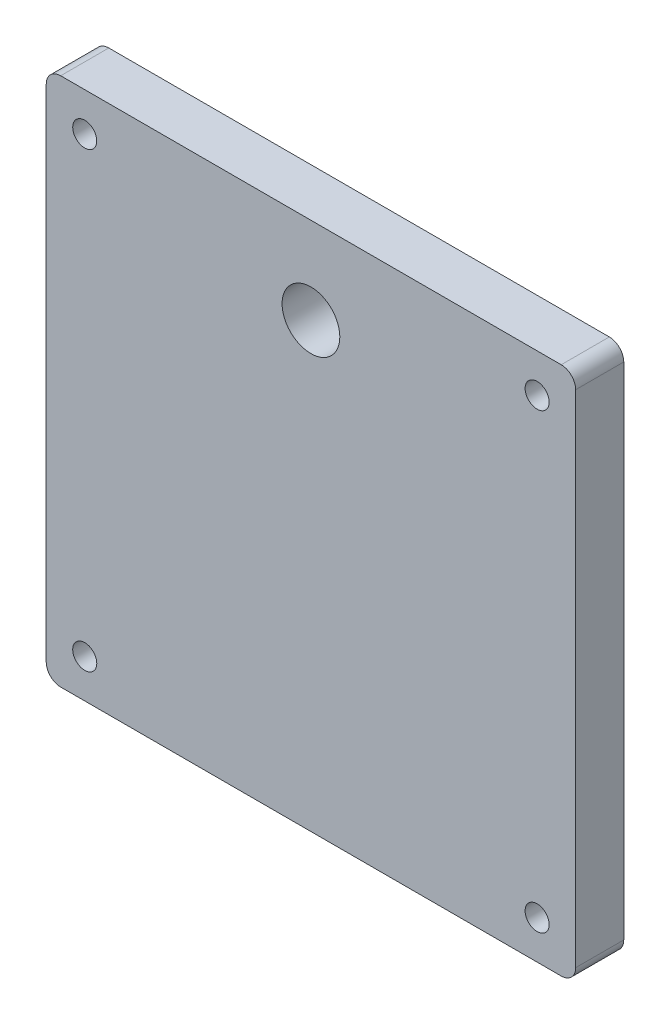
ISO-10303-21;
HEADER;
FILE_DESCRIPTION(('STEP AP214'),'2;1');
FILE_NAME('part.step','',(''),(''),'','','');
FILE_SCHEMA(('AUTOMOTIVE_DESIGN { 1 0 10303 214 1 1 1 1 }'));
ENDSEC;
DATA;
#1=APPLICATION_CONTEXT('core data for automotive mechanical design processes');
#2=APPLICATION_PROTOCOL_DEFINITION('international standard','automotive_design',2000,#1);
#3=PRODUCT_CONTEXT('',#1,'mechanical');
#4=PRODUCT('Part','Part','',(#3));
#5=PRODUCT_RELATED_PRODUCT_CATEGORY('part','',(#4));
#6=PRODUCT_DEFINITION_FORMATION('','',#4);
#7=PRODUCT_DEFINITION_CONTEXT('part definition',#1,'design');
#8=PRODUCT_DEFINITION('design','',#6,#7);
#9=PRODUCT_DEFINITION_SHAPE('','',#8);
#10=(LENGTH_UNIT() NAMED_UNIT(*) SI_UNIT(.MILLI.,.METRE.));
#11=(NAMED_UNIT(*) PLANE_ANGLE_UNIT() SI_UNIT($,.RADIAN.));
#12=(NAMED_UNIT(*) SI_UNIT($,.STERADIAN.) SOLID_ANGLE_UNIT());
#13=UNCERTAINTY_MEASURE_WITH_UNIT(LENGTH_MEASURE(1.E-05),#10,'distance_accuracy_value','');
#14=(GEOMETRIC_REPRESENTATION_CONTEXT(3) GLOBAL_UNCERTAINTY_ASSIGNED_CONTEXT((#13)) GLOBAL_UNIT_ASSIGNED_CONTEXT((#10,
#11,#12)) REPRESENTATION_CONTEXT('',''));
#15=CARTESIAN_POINT('',(0.,0.,0.));
#16=DIRECTION('',(0.,0.,1.));
#17=DIRECTION('',(1.,0.,0.));
#18=AXIS2_PLACEMENT_3D('',#15,#16,#17);
#19=CARTESIAN_POINT('',(52.,-52.,10.));
#20=DIRECTION('',(0.,0.,-1.));
#21=DIRECTION('',(-1.,0.,0.));
#22=AXIS2_PLACEMENT_3D('',#19,#20,#21);
#23=PLANE('',#22);
#24=CARTESIAN_POINT('',(52.,-52.,10.));
#25=DIRECTION('',(0.,0.,1.));
#26=DIRECTION('',(-1.,0.,0.));
#27=AXIS2_PLACEMENT_3D('',#24,#25,#26);
#28=CIRCLE('',#27,3.00000000000001);
#29=CARTESIAN_POINT('',(52.,-55.,10.));
#30=VERTEX_POINT('',#29);
#31=CARTESIAN_POINT('',(55.,-52.,10.));
#32=VERTEX_POINT('',#31);
#33=EDGE_CURVE('E154',#30,#32,#28,.T.);
#34=ORIENTED_EDGE('',*,*,#33,.T.);
#35=DIRECTION('',(0.,1.,0.));
#36=VECTOR('',#35,1.);
#37=CARTESIAN_POINT('',(55.,52.,10.));
#38=LINE('',#37,#36);
#39=CARTESIAN_POINT('',(55.,52.,10.));
#40=VERTEX_POINT('',#39);
#41=EDGE_CURVE('E102',#32,#40,#38,.T.);
#42=ORIENTED_EDGE('',*,*,#41,.T.);
#43=CARTESIAN_POINT('',(52.,52.,10.));
#44=DIRECTION('',(0.,0.,1.));
#45=DIRECTION('',(1.,0.,0.));
#46=AXIS2_PLACEMENT_3D('',#43,#44,#45);
#47=CIRCLE('',#46,3.);
#48=CARTESIAN_POINT('',(52.,55.,10.));
#49=VERTEX_POINT('',#48);
#50=EDGE_CURVE('E169',#40,#49,#47,.T.);
#51=ORIENTED_EDGE('',*,*,#50,.T.);
#52=DIRECTION('',(-1.,0.,0.));
#53=VECTOR('',#52,1.);
#54=CARTESIAN_POINT('',(-52.,55.,10.));
#55=LINE('',#54,#53);
#56=CARTESIAN_POINT('',(-52.,55.,10.));
#57=VERTEX_POINT('',#56);
#58=EDGE_CURVE('E182',#49,#57,#55,.T.);
#59=ORIENTED_EDGE('',*,*,#58,.T.);
#60=CARTESIAN_POINT('',(-52.,52.,10.));
#61=DIRECTION('',(0.,0.,1.));
#62=DIRECTION('',(-1.,0.,0.));
#63=AXIS2_PLACEMENT_3D('',#60,#61,#62);
#64=CIRCLE('',#63,3.);
#65=CARTESIAN_POINT('',(-55.,52.,10.));
#66=VERTEX_POINT('',#65);
#67=EDGE_CURVE('E121',#57,#66,#64,.T.);
#68=ORIENTED_EDGE('',*,*,#67,.T.);
#69=DIRECTION('',(0.,-1.,0.));
#70=VECTOR('',#69,1.);
#71=CARTESIAN_POINT('',(-55.,52.,10.));
#72=LINE('',#71,#70);
#73=CARTESIAN_POINT('',(-55.,-52.,10.));
#74=VERTEX_POINT('',#73);
#75=EDGE_CURVE('E115',#66,#74,#72,.T.);
#76=ORIENTED_EDGE('',*,*,#75,.T.);
#77=CARTESIAN_POINT('',(-52.,-52.,10.));
#78=DIRECTION('',(0.,0.,1.));
#79=DIRECTION('',(-1.,0.,0.));
#80=AXIS2_PLACEMENT_3D('',#77,#78,#79);
#81=CIRCLE('',#80,3.00000000000001);
#82=CARTESIAN_POINT('',(-52.,-55.,10.));
#83=VERTEX_POINT('',#82);
#84=EDGE_CURVE('E119',#74,#83,#81,.T.);
#85=ORIENTED_EDGE('',*,*,#84,.T.);
#86=DIRECTION('',(1.,0.,0.));
#87=VECTOR('',#86,1.);
#88=CARTESIAN_POINT('',(-52.,-55.,10.));
#89=LINE('',#88,#87);
#90=EDGE_CURVE('E59',#83,#30,#89,.T.);
#91=ORIENTED_EDGE('',*,*,#90,.T.);
#92=EDGE_LOOP('',(#34,#42,#51,#59,#68,#76,#85,#91));
#93=FACE_BOUND('',#92,.T.);
#94=CARTESIAN_POINT('',(47.,47.,10.));
#95=DIRECTION('',(0.,0.,1.));
#96=DIRECTION('',(1.,0.,0.));
#97=AXIS2_PLACEMENT_3D('',#94,#95,#96);
#98=CIRCLE('',#97,2.5);
#99=CARTESIAN_POINT('',(49.5,47.,10.));
#100=VERTEX_POINT('',#99);
#101=EDGE_CURVE('E143',#100,#100,#98,.T.);
#102=ORIENTED_EDGE('',*,*,#101,.F.);
#103=EDGE_LOOP('',(#102));
#104=FACE_BOUND('',#103,.T.);
#105=CARTESIAN_POINT('',(47.,-47.,10.));
#106=DIRECTION('',(0.,0.,1.));
#107=DIRECTION('',(-1.,0.,0.));
#108=AXIS2_PLACEMENT_3D('',#105,#106,#107);
#109=CIRCLE('',#108,2.5);
#110=CARTESIAN_POINT('',(44.5,-47.,10.));
#111=VERTEX_POINT('',#110);
#112=EDGE_CURVE('E191',#111,#111,#109,.T.);
#113=ORIENTED_EDGE('',*,*,#112,.F.);
#114=EDGE_LOOP('',(#113));
#115=FACE_BOUND('',#114,.T.);
#116=CARTESIAN_POINT('',(-47.,-47.,10.));
#117=DIRECTION('',(0.,0.,1.));
#118=DIRECTION('',(1.,0.,0.));
#119=AXIS2_PLACEMENT_3D('',#116,#117,#118);
#120=CIRCLE('',#119,2.5);
#121=CARTESIAN_POINT('',(-44.5,-47.,10.));
#122=VERTEX_POINT('',#121);
#123=EDGE_CURVE('E197',#122,#122,#120,.T.);
#124=ORIENTED_EDGE('',*,*,#123,.F.);
#125=EDGE_LOOP('',(#124));
#126=FACE_BOUND('',#125,.T.);
#127=CARTESIAN_POINT('',(-47.,47.,10.));
#128=DIRECTION('',(0.,0.,1.));
#129=DIRECTION('',(-1.,0.,0.));
#130=AXIS2_PLACEMENT_3D('',#127,#128,#129);
#131=CIRCLE('',#130,2.5);
#132=CARTESIAN_POINT('',(-49.5,47.,10.));
#133=VERTEX_POINT('',#132);
#134=EDGE_CURVE('E203',#133,#133,#131,.T.);
#135=ORIENTED_EDGE('',*,*,#134,.F.);
#136=EDGE_LOOP('',(#135));
#137=FACE_BOUND('',#136,.T.);
#138=CARTESIAN_POINT('',(0.,37.,10.));
#139=DIRECTION('',(0.,0.,1.));
#140=DIRECTION('',(1.,0.,0.));
#141=AXIS2_PLACEMENT_3D('',#138,#139,#140);
#142=CIRCLE('',#141,6.);
#143=CARTESIAN_POINT('',(6.00000000000001,37.,10.));
#144=VERTEX_POINT('',#143);
#145=EDGE_CURVE('E209',#144,#144,#142,.T.);
#146=ORIENTED_EDGE('',*,*,#145,.F.);
#147=EDGE_LOOP('',(#146));
#148=FACE_BOUND('',#147,.T.);
#149=ADVANCED_FACE('F42',(#93,#104,#115,#126,#137,#148),#23,.F.);
#150=CARTESIAN_POINT('',(52.,-52.,0.));
#151=DIRECTION('',(0.,0.,-1.));
#152=DIRECTION('',(-1.,0.,0.));
#153=AXIS2_PLACEMENT_3D('',#150,#151,#152);
#154=PLANE('',#153);
#155=CARTESIAN_POINT('',(-47.,47.,0.));
#156=DIRECTION('',(0.,0.,1.));
#157=DIRECTION('',(-1.,0.,0.));
#158=AXIS2_PLACEMENT_3D('',#155,#156,#157);
#159=CIRCLE('',#158,2.5);
#160=CARTESIAN_POINT('',(-49.5,47.,0.));
#161=VERTEX_POINT('',#160);
#162=EDGE_CURVE('E206',#161,#161,#159,.T.);
#163=ORIENTED_EDGE('',*,*,#162,.T.);
#164=EDGE_LOOP('',(#163));
#165=FACE_BOUND('',#164,.T.);
#166=CARTESIAN_POINT('',(47.,-47.,0.));
#167=DIRECTION('',(0.,0.,1.));
#168=DIRECTION('',(-1.,0.,0.));
#169=AXIS2_PLACEMENT_3D('',#166,#167,#168);
#170=CIRCLE('',#169,2.5);
#171=CARTESIAN_POINT('',(44.5,-47.,0.));
#172=VERTEX_POINT('',#171);
#173=EDGE_CURVE('E194',#172,#172,#170,.T.);
#174=ORIENTED_EDGE('',*,*,#173,.T.);
#175=EDGE_LOOP('',(#174));
#176=FACE_BOUND('',#175,.T.);
#177=CARTESIAN_POINT('',(52.,-52.,0.));
#178=DIRECTION('',(0.,0.,1.));
#179=DIRECTION('',(-1.,0.,0.));
#180=AXIS2_PLACEMENT_3D('',#177,#178,#179);
#181=CIRCLE('',#180,3.00000000000001);
#182=CARTESIAN_POINT('',(52.,-55.,0.));
#183=VERTEX_POINT('',#182);
#184=CARTESIAN_POINT('',(55.,-52.,0.));
#185=VERTEX_POINT('',#184);
#186=EDGE_CURVE('E139',#183,#185,#181,.T.);
#187=ORIENTED_EDGE('',*,*,#186,.F.);
#188=DIRECTION('',(1.,0.,0.));
#189=VECTOR('',#188,1.);
#190=CARTESIAN_POINT('',(-52.,-55.,0.));
#191=LINE('',#190,#189);
#192=CARTESIAN_POINT('',(-52.,-55.,0.));
#193=VERTEX_POINT('',#192);
#194=EDGE_CURVE('E94',#193,#183,#191,.T.);
#195=ORIENTED_EDGE('',*,*,#194,.F.);
#196=CARTESIAN_POINT('',(-52.,-52.,0.));
#197=DIRECTION('',(0.,0.,1.));
#198=DIRECTION('',(-1.,0.,0.));
#199=AXIS2_PLACEMENT_3D('',#196,#197,#198);
#200=CIRCLE('',#199,3.00000000000001);
#201=CARTESIAN_POINT('',(-55.,-52.,0.));
#202=VERTEX_POINT('',#201);
#203=EDGE_CURVE('E88',#202,#193,#200,.T.);
#204=ORIENTED_EDGE('',*,*,#203,.F.);
#205=DIRECTION('',(0.,-1.,0.));
#206=VECTOR('',#205,1.);
#207=CARTESIAN_POINT('',(-55.,52.,0.));
#208=LINE('',#207,#206);
#209=CARTESIAN_POINT('',(-55.,52.,0.));
#210=VERTEX_POINT('',#209);
#211=EDGE_CURVE('E129',#210,#202,#208,.T.);
#212=ORIENTED_EDGE('',*,*,#211,.F.);
#213=CARTESIAN_POINT('',(-52.,52.,0.));
#214=DIRECTION('',(0.,0.,1.));
#215=DIRECTION('',(-1.,0.,0.));
#216=AXIS2_PLACEMENT_3D('',#213,#214,#215);
#217=CIRCLE('',#216,3.);
#218=CARTESIAN_POINT('',(-52.,55.,0.));
#219=VERTEX_POINT('',#218);
#220=EDGE_CURVE('E149',#219,#210,#217,.T.);
#221=ORIENTED_EDGE('',*,*,#220,.F.);
#222=DIRECTION('',(-1.,0.,0.));
#223=VECTOR('',#222,1.);
#224=CARTESIAN_POINT('',(-52.,55.,0.));
#225=LINE('',#224,#223);
#226=CARTESIAN_POINT('',(52.,55.,0.));
#227=VERTEX_POINT('',#226);
#228=EDGE_CURVE('E147',#227,#219,#225,.T.);
#229=ORIENTED_EDGE('',*,*,#228,.F.);
#230=CARTESIAN_POINT('',(52.,52.,0.));
#231=DIRECTION('',(0.,0.,1.));
#232=DIRECTION('',(1.,0.,0.));
#233=AXIS2_PLACEMENT_3D('',#230,#231,#232);
#234=CIRCLE('',#233,3.);
#235=CARTESIAN_POINT('',(55.,52.,0.));
#236=VERTEX_POINT('',#235);
#237=EDGE_CURVE('E145',#236,#227,#234,.T.);
#238=ORIENTED_EDGE('',*,*,#237,.F.);
#239=DIRECTION('',(0.,1.,0.));
#240=VECTOR('',#239,1.);
#241=CARTESIAN_POINT('',(55.,52.,0.));
#242=LINE('',#241,#240);
#243=EDGE_CURVE('E142',#185,#236,#242,.T.);
#244=ORIENTED_EDGE('',*,*,#243,.F.);
#245=EDGE_LOOP('',(#187,#195,#204,#212,#221,#229,#238,#244));
#246=FACE_BOUND('',#245,.T.);
#247=CARTESIAN_POINT('',(47.,47.,0.));
#248=DIRECTION('',(0.,0.,1.));
#249=DIRECTION('',(1.,0.,0.));
#250=AXIS2_PLACEMENT_3D('',#247,#248,#249);
#251=CIRCLE('',#250,2.5);
#252=CARTESIAN_POINT('',(49.5,47.,0.));
#253=VERTEX_POINT('',#252);
#254=EDGE_CURVE('E188',#253,#253,#251,.T.);
#255=ORIENTED_EDGE('',*,*,#254,.T.);
#256=EDGE_LOOP('',(#255));
#257=FACE_BOUND('',#256,.T.);
#258=CARTESIAN_POINT('',(-47.,-47.,0.));
#259=DIRECTION('',(0.,0.,1.));
#260=DIRECTION('',(1.,0.,0.));
#261=AXIS2_PLACEMENT_3D('',#258,#259,#260);
#262=CIRCLE('',#261,2.5);
#263=CARTESIAN_POINT('',(-44.5,-47.,0.));
#264=VERTEX_POINT('',#263);
#265=EDGE_CURVE('E200',#264,#264,#262,.T.);
#266=ORIENTED_EDGE('',*,*,#265,.T.);
#267=EDGE_LOOP('',(#266));
#268=FACE_BOUND('',#267,.T.);
#269=CARTESIAN_POINT('',(0.,37.,0.));
#270=DIRECTION('',(0.,0.,1.));
#271=DIRECTION('',(1.,0.,0.));
#272=AXIS2_PLACEMENT_3D('',#269,#270,#271);
#273=CIRCLE('',#272,6.);
#274=CARTESIAN_POINT('',(6.00000000000001,37.,0.));
#275=VERTEX_POINT('',#274);
#276=EDGE_CURVE('E212',#275,#275,#273,.T.);
#277=ORIENTED_EDGE('',*,*,#276,.T.);
#278=EDGE_LOOP('',(#277));
#279=FACE_BOUND('',#278,.T.);
#280=ADVANCED_FACE('F173',(#165,#176,#246,#257,#268,#279),#154,.T.);
#281=CARTESIAN_POINT('',(52.,-52.,10.));
#282=DIRECTION('',(0.,0.,-1.));
#283=DIRECTION('',(-1.,0.,0.));
#284=AXIS2_PLACEMENT_3D('',#281,#282,#283);
#285=CYLINDRICAL_SURFACE('',#284,3.00000000000001);
#286=ORIENTED_EDGE('',*,*,#186,.T.);
#287=DIRECTION('',(0.,0.,-1.));
#288=VECTOR('',#287,1.);
#289=CARTESIAN_POINT('',(55.,-52.,10.));
#290=LINE('',#289,#288);
#291=EDGE_CURVE('E13',#32,#185,#290,.T.);
#292=ORIENTED_EDGE('',*,*,#291,.F.);
#293=ORIENTED_EDGE('',*,*,#33,.F.);
#294=DIRECTION('',(0.,0.,-1.));
#295=VECTOR('',#294,1.);
#296=CARTESIAN_POINT('',(52.,-55.,10.));
#297=LINE('',#296,#295);
#298=EDGE_CURVE('E135',#30,#183,#297,.T.);
#299=ORIENTED_EDGE('',*,*,#298,.T.);
#300=EDGE_LOOP('',(#286,#292,#293,#299));
#301=FACE_BOUND('',#300,.T.);
#302=ADVANCED_FACE('F44',(#301),#285,.T.);
#303=CARTESIAN_POINT('',(55.,52.,10.));
#304=DIRECTION('',(-1.,0.,0.));
#305=DIRECTION('',(0.,-1.,0.));
#306=AXIS2_PLACEMENT_3D('',#303,#304,#305);
#307=PLANE('',#306);
#308=ORIENTED_EDGE('',*,*,#243,.T.);
#309=DIRECTION('',(0.,0.,-1.));
#310=VECTOR('',#309,1.);
#311=CARTESIAN_POINT('',(55.,52.,10.));
#312=LINE('',#311,#310);
#313=EDGE_CURVE('E51',#40,#236,#312,.T.);
#314=ORIENTED_EDGE('',*,*,#313,.F.);
#315=ORIENTED_EDGE('',*,*,#41,.F.);
#316=ORIENTED_EDGE('',*,*,#291,.T.);
#317=EDGE_LOOP('',(#308,#314,#315,#316));
#318=FACE_BOUND('',#317,.T.);
#319=ADVANCED_FACE('F244',(#318),#307,.F.);
#320=CARTESIAN_POINT('',(52.,52.,10.));
#321=DIRECTION('',(0.,0.,-1.));
#322=DIRECTION('',(-1.,0.,0.));
#323=AXIS2_PLACEMENT_3D('',#320,#321,#322);
#324=CYLINDRICAL_SURFACE('',#323,3.);
#325=ORIENTED_EDGE('',*,*,#237,.T.);
#326=DIRECTION('',(0.,0.,-1.));
#327=VECTOR('',#326,1.);
#328=CARTESIAN_POINT('',(52.,55.,10.));
#329=LINE('',#328,#327);
#330=EDGE_CURVE('E161',#49,#227,#329,.T.);
#331=ORIENTED_EDGE('',*,*,#330,.F.);
#332=ORIENTED_EDGE('',*,*,#50,.F.);
#333=ORIENTED_EDGE('',*,*,#313,.T.);
#334=EDGE_LOOP('',(#325,#331,#332,#333));
#335=FACE_BOUND('',#334,.T.);
#336=ADVANCED_FACE('F167',(#335),#324,.T.);
#337=CARTESIAN_POINT('',(-52.,55.,10.));
#338=DIRECTION('',(0.,-1.,0.));
#339=DIRECTION('',(1.,0.,0.));
#340=AXIS2_PLACEMENT_3D('',#337,#338,#339);
#341=PLANE('',#340);
#342=ORIENTED_EDGE('',*,*,#228,.T.);
#343=DIRECTION('',(0.,0.,-1.));
#344=VECTOR('',#343,1.);
#345=CARTESIAN_POINT('',(-52.,55.,10.));
#346=LINE('',#345,#344);
#347=EDGE_CURVE('E158',#57,#219,#346,.T.);
#348=ORIENTED_EDGE('',*,*,#347,.F.);
#349=ORIENTED_EDGE('',*,*,#58,.F.);
#350=ORIENTED_EDGE('',*,*,#330,.T.);
#351=EDGE_LOOP('',(#342,#348,#349,#350));
#352=FACE_BOUND('',#351,.T.);
#353=ADVANCED_FACE('F178',(#352),#341,.F.);
#354=CARTESIAN_POINT('',(-52.,52.,10.));
#355=DIRECTION('',(0.,0.,-1.));
#356=DIRECTION('',(-1.,0.,0.));
#357=AXIS2_PLACEMENT_3D('',#354,#355,#356);
#358=CYLINDRICAL_SURFACE('',#357,3.);
#359=ORIENTED_EDGE('',*,*,#220,.T.);
#360=DIRECTION('',(0.,0.,-1.));
#361=VECTOR('',#360,1.);
#362=CARTESIAN_POINT('',(-55.,52.,10.));
#363=LINE('',#362,#361);
#364=EDGE_CURVE('E130',#66,#210,#363,.T.);
#365=ORIENTED_EDGE('',*,*,#364,.F.);
#366=ORIENTED_EDGE('',*,*,#67,.F.);
#367=ORIENTED_EDGE('',*,*,#347,.T.);
#368=EDGE_LOOP('',(#359,#365,#366,#367));
#369=FACE_BOUND('',#368,.T.);
#370=ADVANCED_FACE('F181',(#369),#358,.T.);
#371=CARTESIAN_POINT('',(-55.,52.,10.));
#372=DIRECTION('',(1.,0.,0.));
#373=DIRECTION('',(0.,0.,-1.));
#374=AXIS2_PLACEMENT_3D('',#371,#372,#373);
#375=PLANE('',#374);
#376=ORIENTED_EDGE('',*,*,#211,.T.);
#377=DIRECTION('',(0.,0.,-1.));
#378=VECTOR('',#377,1.);
#379=CARTESIAN_POINT('',(-55.,-52.,10.));
#380=LINE('',#379,#378);
#381=EDGE_CURVE('E126',#74,#202,#380,.T.);
#382=ORIENTED_EDGE('',*,*,#381,.F.);
#383=ORIENTED_EDGE('',*,*,#75,.F.);
#384=ORIENTED_EDGE('',*,*,#364,.T.);
#385=EDGE_LOOP('',(#376,#382,#383,#384));
#386=FACE_BOUND('',#385,.T.);
#387=ADVANCED_FACE('F127',(#386),#375,.F.);
#388=CARTESIAN_POINT('',(-52.,-52.,10.));
#389=DIRECTION('',(0.,0.,-1.));
#390=DIRECTION('',(-1.,0.,0.));
#391=AXIS2_PLACEMENT_3D('',#388,#389,#390);
#392=CYLINDRICAL_SURFACE('',#391,3.00000000000001);
#393=ORIENTED_EDGE('',*,*,#203,.T.);
#394=DIRECTION('',(0.,0.,-1.));
#395=VECTOR('',#394,1.);
#396=CARTESIAN_POINT('',(-52.,-55.,10.));
#397=LINE('',#396,#395);
#398=EDGE_CURVE('E131',#83,#193,#397,.T.);
#399=ORIENTED_EDGE('',*,*,#398,.F.);
#400=ORIENTED_EDGE('',*,*,#84,.F.);
#401=ORIENTED_EDGE('',*,*,#381,.T.);
#402=EDGE_LOOP('',(#393,#399,#400,#401));
#403=FACE_BOUND('',#402,.T.);
#404=ADVANCED_FACE('F133',(#403),#392,.T.);
#405=CARTESIAN_POINT('',(-52.,-55.,10.));
#406=DIRECTION('',(0.,1.,0.));
#407=DIRECTION('',(0.,0.,1.));
#408=AXIS2_PLACEMENT_3D('',#405,#406,#407);
#409=PLANE('',#408);
#410=ORIENTED_EDGE('',*,*,#194,.T.);
#411=ORIENTED_EDGE('',*,*,#298,.F.);
#412=ORIENTED_EDGE('',*,*,#90,.F.);
#413=ORIENTED_EDGE('',*,*,#398,.T.);
#414=EDGE_LOOP('',(#410,#411,#412,#413));
#415=FACE_BOUND('',#414,.T.);
#416=ADVANCED_FACE('F232',(#415),#409,.F.);
#417=CARTESIAN_POINT('',(47.,47.,10.));
#418=DIRECTION('',(0.,0.,-1.));
#419=DIRECTION('',(-1.,0.,0.));
#420=AXIS2_PLACEMENT_3D('',#417,#418,#419);
#421=CYLINDRICAL_SURFACE('',#420,2.5);
#422=ORIENTED_EDGE('',*,*,#101,.T.);
#423=EDGE_LOOP('',(#422));
#424=FACE_BOUND('',#423,.T.);
#425=ORIENTED_EDGE('',*,*,#254,.F.);
#426=EDGE_LOOP('',(#425));
#427=FACE_BOUND('',#426,.T.);
#428=ADVANCED_FACE('F229',(#424,#427),#421,.F.);
#429=CARTESIAN_POINT('',(47.,-47.,10.));
#430=DIRECTION('',(0.,0.,-1.));
#431=DIRECTION('',(-1.,0.,0.));
#432=AXIS2_PLACEMENT_3D('',#429,#430,#431);
#433=CYLINDRICAL_SURFACE('',#432,2.5);
#434=ORIENTED_EDGE('',*,*,#112,.T.);
#435=EDGE_LOOP('',(#434));
#436=FACE_BOUND('',#435,.T.);
#437=ORIENTED_EDGE('',*,*,#173,.F.);
#438=EDGE_LOOP('',(#437));
#439=FACE_BOUND('',#438,.T.);
#440=ADVANCED_FACE('F308',(#436,#439),#433,.F.);
#441=CARTESIAN_POINT('',(-47.,-47.,10.));
#442=DIRECTION('',(0.,0.,-1.));
#443=DIRECTION('',(-1.,0.,0.));
#444=AXIS2_PLACEMENT_3D('',#441,#442,#443);
#445=CYLINDRICAL_SURFACE('',#444,2.5);
#446=ORIENTED_EDGE('',*,*,#123,.T.);
#447=EDGE_LOOP('',(#446));
#448=FACE_BOUND('',#447,.T.);
#449=ORIENTED_EDGE('',*,*,#265,.F.);
#450=EDGE_LOOP('',(#449));
#451=FACE_BOUND('',#450,.T.);
#452=ADVANCED_FACE('F316',(#448,#451),#445,.F.);
#453=CARTESIAN_POINT('',(-47.,47.,10.));
#454=DIRECTION('',(0.,0.,-1.));
#455=DIRECTION('',(-1.,0.,0.));
#456=AXIS2_PLACEMENT_3D('',#453,#454,#455);
#457=CYLINDRICAL_SURFACE('',#456,2.5);
#458=ORIENTED_EDGE('',*,*,#134,.T.);
#459=EDGE_LOOP('',(#458));
#460=FACE_BOUND('',#459,.T.);
#461=ORIENTED_EDGE('',*,*,#162,.F.);
#462=EDGE_LOOP('',(#461));
#463=FACE_BOUND('',#462,.T.);
#464=ADVANCED_FACE('F324',(#460,#463),#457,.F.);
#465=CARTESIAN_POINT('',(0.,37.,10.));
#466=DIRECTION('',(0.,0.,-1.));
#467=DIRECTION('',(-1.,0.,0.));
#468=AXIS2_PLACEMENT_3D('',#465,#466,#467);
#469=CYLINDRICAL_SURFACE('',#468,6.);
#470=ORIENTED_EDGE('',*,*,#145,.T.);
#471=EDGE_LOOP('',(#470));
#472=FACE_BOUND('',#471,.T.);
#473=ORIENTED_EDGE('',*,*,#276,.F.);
#474=EDGE_LOOP('',(#473));
#475=FACE_BOUND('',#474,.T.);
#476=ADVANCED_FACE('F218',(#472,#475),#469,.F.);
#477=CLOSED_SHELL('',(#149,#280,#302,#319,#336,#353,#370,#387,#404,#416,#428,#440,#452,#464,#476));
#478=MANIFOLD_SOLID_BREP('B2',#477);
#479=ADVANCED_BREP_SHAPE_REPRESENTATION('',(#18,#478),#14);
#480=SHAPE_DEFINITION_REPRESENTATION(#9,#479);
ENDSEC;
END-ISO-10303-21;
